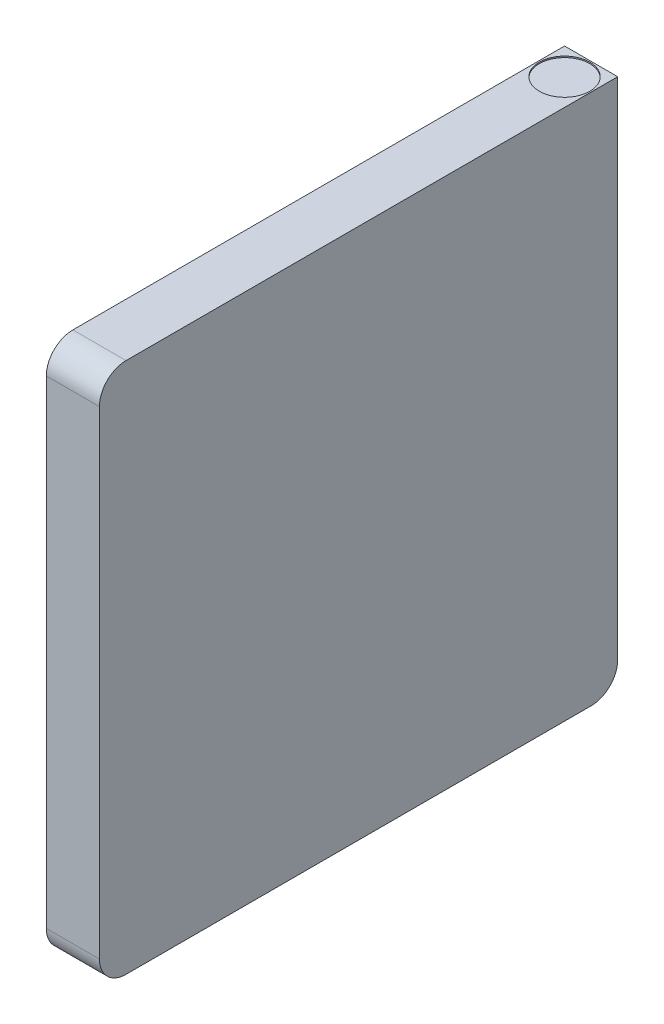
ISO-10303-21;
HEADER;
FILE_DESCRIPTION(('STEP AP214'),'2;1');
FILE_NAME('part.step','',(''),(''),'','','');
FILE_SCHEMA(('AUTOMOTIVE_DESIGN { 1 0 10303 214 1 1 1 1 }'));
ENDSEC;
DATA;
#1=APPLICATION_CONTEXT('core data for automotive mechanical design processes');
#2=APPLICATION_PROTOCOL_DEFINITION('international standard','automotive_design',2000,#1);
#3=PRODUCT_CONTEXT('',#1,'mechanical');
#4=PRODUCT('Part','Part','',(#3));
#5=PRODUCT_RELATED_PRODUCT_CATEGORY('part','',(#4));
#6=PRODUCT_DEFINITION_FORMATION('','',#4);
#7=PRODUCT_DEFINITION_CONTEXT('part definition',#1,'design');
#8=PRODUCT_DEFINITION('design','',#6,#7);
#9=PRODUCT_DEFINITION_SHAPE('','',#8);
#10=(LENGTH_UNIT() NAMED_UNIT(*) SI_UNIT(.MILLI.,.METRE.));
#11=(NAMED_UNIT(*) PLANE_ANGLE_UNIT() SI_UNIT($,.RADIAN.));
#12=(NAMED_UNIT(*) SI_UNIT($,.STERADIAN.) SOLID_ANGLE_UNIT());
#13=UNCERTAINTY_MEASURE_WITH_UNIT(LENGTH_MEASURE(1.E-05),#10,'distance_accuracy_value','');
#14=(GEOMETRIC_REPRESENTATION_CONTEXT(3) GLOBAL_UNCERTAINTY_ASSIGNED_CONTEXT((#13)) GLOBAL_UNIT_ASSIGNED_CONTEXT((#10,
#11,#12)) REPRESENTATION_CONTEXT('',''));
#15=CARTESIAN_POINT('',(0.,0.,0.));
#16=DIRECTION('',(0.,0.,1.));
#17=DIRECTION('',(1.,0.,0.));
#18=AXIS2_PLACEMENT_3D('',#15,#16,#17);
#19=CARTESIAN_POINT('',(-4.00000000000001,25.490763705489,39.));
#20=DIRECTION('',(1.,0.,0.));
#21=DIRECTION('',(0.,1.,0.));
#22=AXIS2_PLACEMENT_3D('',#19,#20,#21);
#23=PLANE('',#22);
#24=DIRECTION('',(0.,-1.,0.));
#25=VECTOR('',#24,1.);
#26=CARTESIAN_POINT('',(-4.00000000000001,25.490763705489,0.));
#27=LINE('',#26,#25);
#28=CARTESIAN_POINT('',(-4.00000000000001,25.490763705489,0.));
#29=VERTEX_POINT('',#28);
#30=CARTESIAN_POINT('',(-4.,-12.509236294511,0.));
#31=VERTEX_POINT('',#30);
#32=EDGE_CURVE('E107',#29,#31,#27,.T.);
#33=ORIENTED_EDGE('',*,*,#32,.T.);
#34=CARTESIAN_POINT('',(-4.,-12.509236294511,2.));
#35=DIRECTION('',(1.,0.,0.));
#36=DIRECTION('',(0.,1.,0.));
#37=AXIS2_PLACEMENT_3D('',#34,#35,#36);
#38=CIRCLE('',#37,2.);
#39=CARTESIAN_POINT('',(-4.,-14.509236294511,2.));
#40=VERTEX_POINT('',#39);
#41=EDGE_CURVE('E43',#31,#40,#38,.F.);
#42=ORIENTED_EDGE('',*,*,#41,.T.);
#43=DIRECTION('',(0.,0.,-1.));
#44=VECTOR('',#43,1.);
#45=CARTESIAN_POINT('',(-4.,-14.509236294511,39.));
#46=LINE('',#45,#44);
#47=CARTESIAN_POINT('',(-4.,-14.509236294511,37.));
#48=VERTEX_POINT('',#47);
#49=EDGE_CURVE('E127',#48,#40,#46,.T.);
#50=ORIENTED_EDGE('',*,*,#49,.F.);
#51=CARTESIAN_POINT('',(-4.,-12.509236294511,37.));
#52=DIRECTION('',(1.,0.,0.));
#53=DIRECTION('',(0.,1.,0.));
#54=AXIS2_PLACEMENT_3D('',#51,#52,#53);
#55=CIRCLE('',#54,2.);
#56=CARTESIAN_POINT('',(-4.,-12.509236294511,39.));
#57=VERTEX_POINT('',#56);
#58=EDGE_CURVE('E50',#48,#57,#55,.F.);
#59=ORIENTED_EDGE('',*,*,#58,.T.);
#60=DIRECTION('',(0.,-1.,0.));
#61=VECTOR('',#60,1.);
#62=CARTESIAN_POINT('',(-4.00000000000001,25.490763705489,39.));
#63=LINE('',#62,#61);
#64=CARTESIAN_POINT('',(-4.00000000000001,23.490763705489,39.));
#65=VERTEX_POINT('',#64);
#66=EDGE_CURVE('E119',#65,#57,#63,.T.);
#67=ORIENTED_EDGE('',*,*,#66,.F.);
#68=CARTESIAN_POINT('',(-4.00000000000001,23.490763705489,37.));
#69=DIRECTION('',(1.,0.,0.));
#70=DIRECTION('',(0.,1.,0.));
#71=AXIS2_PLACEMENT_3D('',#68,#69,#70);
#72=CIRCLE('',#71,2.);
#73=CARTESIAN_POINT('',(-4.00000000000001,25.490763705489,37.));
#74=VERTEX_POINT('',#73);
#75=EDGE_CURVE('E133',#65,#74,#72,.F.);
#76=ORIENTED_EDGE('',*,*,#75,.T.);
#77=DIRECTION('',(0.,0.,-1.));
#78=VECTOR('',#77,1.);
#79=CARTESIAN_POINT('',(-4.00000000000001,25.490763705489,39.));
#80=LINE('',#79,#78);
#81=EDGE_CURVE('E116',#74,#29,#80,.T.);
#82=ORIENTED_EDGE('',*,*,#81,.T.);
#83=EDGE_LOOP('',(#33,#42,#50,#59,#67,#76,#82));
#84=FACE_BOUND('',#83,.T.);
#85=ADVANCED_FACE('F35',(#84),#23,.F.);
#86=CARTESIAN_POINT('',(-4.,-14.509236294511,39.));
#87=DIRECTION('',(0.,1.,0.));
#88=DIRECTION('',(0.,0.,1.));
#89=AXIS2_PLACEMENT_3D('',#86,#87,#88);
#90=PLANE('',#89);
#91=ORIENTED_EDGE('',*,*,#49,.T.);
#92=DIRECTION('',(1.,0.,0.));
#93=VECTOR('',#92,1.);
#94=CARTESIAN_POINT('',(-4.,-14.509236294511,2.));
#95=LINE('',#94,#93);
#96=CARTESIAN_POINT('',(0.,-14.509236294511,2.));
#97=VERTEX_POINT('',#96);
#98=EDGE_CURVE('E140',#40,#97,#95,.T.);
#99=ORIENTED_EDGE('',*,*,#98,.T.);
#100=DIRECTION('',(0.,0.,-1.));
#101=VECTOR('',#100,1.);
#102=CARTESIAN_POINT('',(0.,-14.509236294511,39.));
#103=LINE('',#102,#101);
#104=CARTESIAN_POINT('',(0.,-14.509236294511,37.));
#105=VERTEX_POINT('',#104);
#106=EDGE_CURVE('E115',#105,#97,#103,.T.);
#107=ORIENTED_EDGE('',*,*,#106,.F.);
#108=DIRECTION('',(1.,0.,0.));
#109=VECTOR('',#108,1.);
#110=CARTESIAN_POINT('',(-4.,-14.509236294511,37.));
#111=LINE('',#110,#109);
#112=EDGE_CURVE('E138',#105,#48,#111,.F.);
#113=ORIENTED_EDGE('',*,*,#112,.T.);
#114=EDGE_LOOP('',(#91,#99,#107,#113));
#115=FACE_BOUND('',#114,.T.);
#116=ADVANCED_FACE('F151',(#115),#90,.F.);
#117=CARTESIAN_POINT('',(0.,25.490763705489,39.));
#118=DIRECTION('',(-1.,0.,0.));
#119=DIRECTION('',(0.,-1.,0.));
#120=AXIS2_PLACEMENT_3D('',#117,#118,#119);
#121=PLANE('',#120);
#122=ORIENTED_EDGE('',*,*,#106,.T.);
#123=CARTESIAN_POINT('',(0.,-12.509236294511,2.));
#124=DIRECTION('',(-1.,0.,0.));
#125=DIRECTION('',(0.,-1.,0.));
#126=AXIS2_PLACEMENT_3D('',#123,#124,#125);
#127=CIRCLE('',#126,2.);
#128=CARTESIAN_POINT('',(0.,-12.509236294511,0.));
#129=VERTEX_POINT('',#128);
#130=EDGE_CURVE('E104',#97,#129,#127,.F.);
#131=ORIENTED_EDGE('',*,*,#130,.T.);
#132=DIRECTION('',(0.,1.,0.));
#133=VECTOR('',#132,1.);
#134=CARTESIAN_POINT('',(0.,25.490763705489,0.));
#135=LINE('',#134,#133);
#136=CARTESIAN_POINT('',(0.,25.490763705489,0.));
#137=VERTEX_POINT('',#136);
#138=EDGE_CURVE('E97',#129,#137,#135,.T.);
#139=ORIENTED_EDGE('',*,*,#138,.T.);
#140=DIRECTION('',(0.,0.,-1.));
#141=VECTOR('',#140,1.);
#142=CARTESIAN_POINT('',(0.,25.490763705489,39.));
#143=LINE('',#142,#141);
#144=CARTESIAN_POINT('',(0.,25.490763705489,37.));
#145=VERTEX_POINT('',#144);
#146=EDGE_CURVE('E102',#145,#137,#143,.T.);
#147=ORIENTED_EDGE('',*,*,#146,.F.);
#148=CARTESIAN_POINT('',(0.,23.490763705489,37.));
#149=DIRECTION('',(-1.,0.,0.));
#150=DIRECTION('',(0.,-1.,0.));
#151=AXIS2_PLACEMENT_3D('',#148,#149,#150);
#152=CIRCLE('',#151,2.);
#153=CARTESIAN_POINT('',(0.,23.490763705489,39.));
#154=VERTEX_POINT('',#153);
#155=EDGE_CURVE('E136',#145,#154,#152,.F.);
#156=ORIENTED_EDGE('',*,*,#155,.T.);
#157=DIRECTION('',(0.,1.,0.));
#158=VECTOR('',#157,1.);
#159=CARTESIAN_POINT('',(0.,25.490763705489,39.));
#160=LINE('',#159,#158);
#161=CARTESIAN_POINT('',(0.,-12.509236294511,39.));
#162=VERTEX_POINT('',#161);
#163=EDGE_CURVE('E121',#162,#154,#160,.T.);
#164=ORIENTED_EDGE('',*,*,#163,.F.);
#165=CARTESIAN_POINT('',(0.,-12.509236294511,37.));
#166=DIRECTION('',(-1.,0.,0.));
#167=DIRECTION('',(0.,-1.,0.));
#168=AXIS2_PLACEMENT_3D('',#165,#166,#167);
#169=CIRCLE('',#168,2.);
#170=EDGE_CURVE('E143',#162,#105,#169,.F.);
#171=ORIENTED_EDGE('',*,*,#170,.T.);
#172=EDGE_LOOP('',(#122,#131,#139,#147,#156,#164,#171));
#173=FACE_BOUND('',#172,.T.);
#174=ADVANCED_FACE('F100',(#173),#121,.F.);
#175=CARTESIAN_POINT('',(-4.00000000000001,25.490763705489,39.));
#176=DIRECTION('',(0.,-1.,0.));
#177=DIRECTION('',(0.,0.,-1.));
#178=AXIS2_PLACEMENT_3D('',#175,#176,#177);
#179=PLANE('',#178);
#180=CARTESIAN_POINT('',(-2.00000000000001,25.490763705489,2.));
#181=DIRECTION('',(0.,1.,0.));
#182=DIRECTION('',(0.,0.,1.));
#183=AXIS2_PLACEMENT_3D('',#180,#181,#182);
#184=CIRCLE('',#183,1.9);
#185=CARTESIAN_POINT('',(-2.00000000000001,25.490763705489,3.9));
#186=VERTEX_POINT('',#185);
#187=EDGE_CURVE('E194',#186,#186,#184,.T.);
#188=ORIENTED_EDGE('',*,*,#187,.F.);
#189=EDGE_LOOP('',(#188));
#190=FACE_BOUND('',#189,.T.);
#191=ORIENTED_EDGE('',*,*,#81,.F.);
#192=DIRECTION('',(-1.,0.,0.));
#193=VECTOR('',#192,1.);
#194=CARTESIAN_POINT('',(0.,25.490763705489,37.));
#195=LINE('',#194,#193);
#196=EDGE_CURVE('E114',#74,#145,#195,.F.);
#197=ORIENTED_EDGE('',*,*,#196,.T.);
#198=ORIENTED_EDGE('',*,*,#146,.T.);
#199=DIRECTION('',(-1.,0.,0.));
#200=VECTOR('',#199,1.);
#201=CARTESIAN_POINT('',(-4.00000000000001,25.490763705489,0.));
#202=LINE('',#201,#200);
#203=EDGE_CURVE('E106',#137,#29,#202,.T.);
#204=ORIENTED_EDGE('',*,*,#203,.T.);
#205=EDGE_LOOP('',(#191,#197,#198,#204));
#206=FACE_BOUND('',#205,.T.);
#207=ADVANCED_FACE('F112',(#190,#206),#179,.F.);
#208=CARTESIAN_POINT('',(0.,0.,39.));
#209=DIRECTION('',(0.,0.,1.));
#210=DIRECTION('',(1.,0.,0.));
#211=AXIS2_PLACEMENT_3D('',#208,#209,#210);
#212=PLANE('',#211);
#213=ORIENTED_EDGE('',*,*,#66,.T.);
#214=DIRECTION('',(1.,0.,0.));
#215=VECTOR('',#214,1.);
#216=CARTESIAN_POINT('',(0.,-12.509236294511,39.));
#217=LINE('',#216,#215);
#218=EDGE_CURVE('E11',#57,#162,#217,.T.);
#219=ORIENTED_EDGE('',*,*,#218,.T.);
#220=ORIENTED_EDGE('',*,*,#163,.T.);
#221=DIRECTION('',(-1.,0.,0.));
#222=VECTOR('',#221,1.);
#223=CARTESIAN_POINT('',(-4.00000000000001,23.490763705489,39.));
#224=LINE('',#223,#222);
#225=EDGE_CURVE('E130',#154,#65,#224,.T.);
#226=ORIENTED_EDGE('',*,*,#225,.T.);
#227=EDGE_LOOP('',(#213,#219,#220,#226));
#228=FACE_BOUND('',#227,.T.);
#229=ADVANCED_FACE('F176',(#228),#212,.T.);
#230=CARTESIAN_POINT('',(0.,0.,0.));
#231=DIRECTION('',(0.,0.,1.));
#232=DIRECTION('',(1.,0.,0.));
#233=AXIS2_PLACEMENT_3D('',#230,#231,#232);
#234=PLANE('',#233);
#235=ORIENTED_EDGE('',*,*,#138,.F.);
#236=DIRECTION('',(1.,0.,0.));
#237=VECTOR('',#236,1.);
#238=CARTESIAN_POINT('',(0.,-12.509236294511,0.));
#239=LINE('',#238,#237);
#240=EDGE_CURVE('E58',#129,#31,#239,.F.);
#241=ORIENTED_EDGE('',*,*,#240,.T.);
#242=ORIENTED_EDGE('',*,*,#32,.F.);
#243=ORIENTED_EDGE('',*,*,#203,.F.);
#244=EDGE_LOOP('',(#235,#241,#242,#243));
#245=FACE_BOUND('',#244,.T.);
#246=ADVANCED_FACE('F118',(#245),#234,.F.);
#247=CARTESIAN_POINT('',(0.,23.490763705489,37.));
#248=DIRECTION('',(1.,0.,0.));
#249=DIRECTION('',(0.,0.,-1.));
#250=AXIS2_PLACEMENT_3D('',#247,#248,#249);
#251=CYLINDRICAL_SURFACE('',#250,2.);
#252=ORIENTED_EDGE('',*,*,#155,.F.);
#253=ORIENTED_EDGE('',*,*,#196,.F.);
#254=ORIENTED_EDGE('',*,*,#75,.F.);
#255=ORIENTED_EDGE('',*,*,#225,.F.);
#256=EDGE_LOOP('',(#252,#253,#254,#255));
#257=FACE_BOUND('',#256,.T.);
#258=ADVANCED_FACE('F156',(#257),#251,.T.);
#259=CARTESIAN_POINT('',(-4.,-12.509236294511,2.));
#260=DIRECTION('',(1.,0.,0.));
#261=DIRECTION('',(0.,0.,-1.));
#262=AXIS2_PLACEMENT_3D('',#259,#260,#261);
#263=CYLINDRICAL_SURFACE('',#262,2.);
#264=ORIENTED_EDGE('',*,*,#41,.F.);
#265=ORIENTED_EDGE('',*,*,#240,.F.);
#266=ORIENTED_EDGE('',*,*,#130,.F.);
#267=ORIENTED_EDGE('',*,*,#98,.F.);
#268=EDGE_LOOP('',(#264,#265,#266,#267));
#269=FACE_BOUND('',#268,.T.);
#270=ADVANCED_FACE('F154',(#269),#263,.T.);
#271=CARTESIAN_POINT('',(0.,-12.509236294511,37.));
#272=DIRECTION('',(-1.,0.,0.));
#273=DIRECTION('',(0.,0.,1.));
#274=AXIS2_PLACEMENT_3D('',#271,#272,#273);
#275=CYLINDRICAL_SURFACE('',#274,2.);
#276=ORIENTED_EDGE('',*,*,#58,.F.);
#277=ORIENTED_EDGE('',*,*,#112,.F.);
#278=ORIENTED_EDGE('',*,*,#170,.F.);
#279=ORIENTED_EDGE('',*,*,#218,.F.);
#280=EDGE_LOOP('',(#276,#277,#278,#279));
#281=FACE_BOUND('',#280,.T.);
#282=ADVANCED_FACE('F37',(#281),#275,.T.);
#283=CARTESIAN_POINT('',(-2.00000000000001,25.390763705489,2.));
#284=DIRECTION('',(0.,1.,0.));
#285=DIRECTION('',(0.,0.,1.));
#286=AXIS2_PLACEMENT_3D('',#283,#284,#285);
#287=CYLINDRICAL_SURFACE('',#286,1.9);
#288=CARTESIAN_POINT('',(-2.00000000000001,25.390763705489,2.));
#289=DIRECTION('',(0.,1.,0.));
#290=DIRECTION('',(0.,0.,1.));
#291=AXIS2_PLACEMENT_3D('',#288,#289,#290);
#292=CIRCLE('',#291,1.9);
#293=CARTESIAN_POINT('',(-2.00000000000001,25.390763705489,3.9));
#294=VERTEX_POINT('',#293);
#295=EDGE_CURVE('E193',#294,#294,#292,.T.);
#296=ORIENTED_EDGE('',*,*,#295,.F.);
#297=EDGE_LOOP('',(#296));
#298=FACE_BOUND('',#297,.T.);
#299=ORIENTED_EDGE('',*,*,#187,.T.);
#300=EDGE_LOOP('',(#299));
#301=FACE_BOUND('',#300,.T.);
#302=ADVANCED_FACE('F161',(#298,#301),#287,.F.);
#303=CARTESIAN_POINT('',(-2.00000000000001,25.390763705489,2.));
#304=DIRECTION('',(0.,1.,0.));
#305=DIRECTION('',(0.,0.,1.));
#306=AXIS2_PLACEMENT_3D('',#303,#304,#305);
#307=PLANE('',#306);
#308=ORIENTED_EDGE('',*,*,#295,.T.);
#309=EDGE_LOOP('',(#308));
#310=FACE_BOUND('',#309,.T.);
#311=ADVANCED_FACE('F185',(#310),#307,.T.);
#312=CLOSED_SHELL('',(#85,#116,#174,#207,#229,#246,#258,#270,#282,#302,#311));
#313=MANIFOLD_SOLID_BREP('B2',#312);
#314=ADVANCED_BREP_SHAPE_REPRESENTATION('',(#18,#313),#14);
#315=SHAPE_DEFINITION_REPRESENTATION(#9,#314);
ENDSEC;
END-ISO-10303-21;
